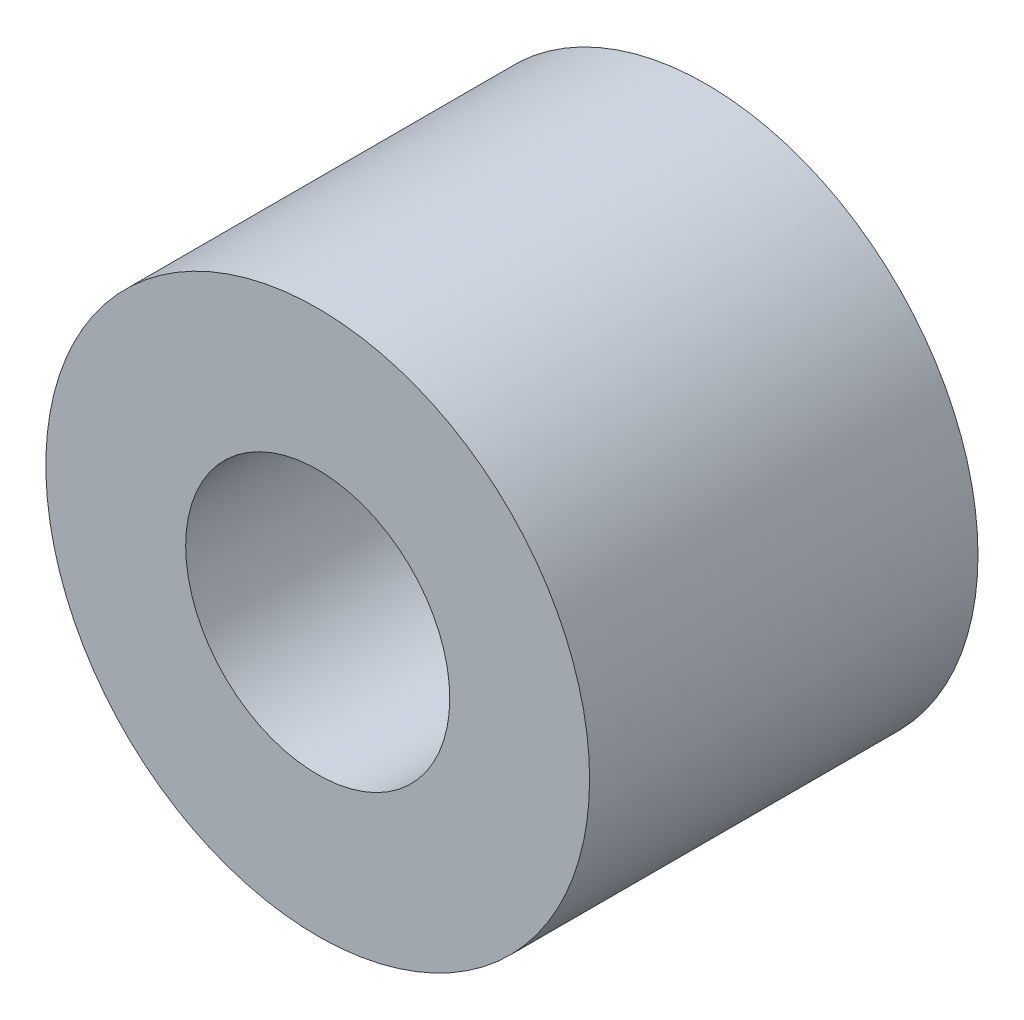
ISO-10303-21;
HEADER;
FILE_DESCRIPTION(('STEP AP214'),'2;1');
FILE_NAME('part.step','',(''),(''),'','','');
FILE_SCHEMA(('AUTOMOTIVE_DESIGN { 1 0 10303 214 1 1 1 1 }'));
ENDSEC;
DATA;
#1=APPLICATION_CONTEXT('core data for automotive mechanical design processes');
#2=APPLICATION_PROTOCOL_DEFINITION('international standard','automotive_design',2000,#1);
#3=PRODUCT_CONTEXT('',#1,'mechanical');
#4=PRODUCT('Part','Part','',(#3));
#5=PRODUCT_RELATED_PRODUCT_CATEGORY('part','',(#4));
#6=PRODUCT_DEFINITION_FORMATION('','',#4);
#7=PRODUCT_DEFINITION_CONTEXT('part definition',#1,'design');
#8=PRODUCT_DEFINITION('design','',#6,#7);
#9=PRODUCT_DEFINITION_SHAPE('','',#8);
#10=(LENGTH_UNIT() NAMED_UNIT(*) SI_UNIT(.MILLI.,.METRE.));
#11=(NAMED_UNIT(*) PLANE_ANGLE_UNIT() SI_UNIT($,.RADIAN.));
#12=(NAMED_UNIT(*) SI_UNIT($,.STERADIAN.) SOLID_ANGLE_UNIT());
#13=UNCERTAINTY_MEASURE_WITH_UNIT(LENGTH_MEASURE(1.E-05),#10,'distance_accuracy_value','');
#14=(GEOMETRIC_REPRESENTATION_CONTEXT(3) GLOBAL_UNCERTAINTY_ASSIGNED_CONTEXT((#13)) GLOBAL_UNIT_ASSIGNED_CONTEXT((#10,
#11,#12)) REPRESENTATION_CONTEXT('',''));
#15=CARTESIAN_POINT('',(0.,0.,0.));
#16=DIRECTION('',(0.,0.,1.));
#17=DIRECTION('',(1.,0.,0.));
#18=AXIS2_PLACEMENT_3D('',#15,#16,#17);
#19=CARTESIAN_POINT('',(21.,-33.5,181.4));
#20=DIRECTION('',(0.,0.,1.));
#21=DIRECTION('',(1.,0.,0.));
#22=AXIS2_PLACEMENT_3D('',#19,#20,#21);
#23=CYLINDRICAL_SURFACE('',#22,1.7);
#24=DIRECTION('',(0.,0.,1.));
#25=VECTOR('',#24,1.);
#26=CARTESIAN_POINT('',(22.7,-33.5,181.4));
#27=LINE('',#26,#25);
#28=CARTESIAN_POINT('',(22.7,-33.5,181.5));
#29=VERTEX_POINT('',#28);
#30=CARTESIAN_POINT('',(22.7,-33.5,186.5));
#31=VERTEX_POINT('',#30);
#32=EDGE_CURVE('E9',#29,#31,#27,.T.);
#33=ORIENTED_EDGE('',*,*,#32,.F.);
#34=CARTESIAN_POINT('',(21.,-33.5,181.5));
#35=DIRECTION('',(0.,0.,1.));
#36=DIRECTION('',(1.,0.,0.));
#37=AXIS2_PLACEMENT_3D('',#34,#35,#36);
#38=CIRCLE('',#37,1.7);
#39=EDGE_CURVE('E23',#29,#29,#38,.T.);
#40=ORIENTED_EDGE('',*,*,#39,.F.);
#41=ORIENTED_EDGE('',*,*,#32,.T.);
#42=CARTESIAN_POINT('',(21.,-33.5,186.5));
#43=DIRECTION('',(0.,0.,1.));
#44=DIRECTION('',(1.,0.,0.));
#45=AXIS2_PLACEMENT_3D('',#42,#43,#44);
#46=CIRCLE('',#45,1.7);
#47=EDGE_CURVE('E54',#31,#31,#46,.T.);
#48=ORIENTED_EDGE('',*,*,#47,.T.);
#49=EDGE_LOOP('',(#33,#40,#41,#48));
#50=FACE_BOUND('',#49,.T.);
#51=ADVANCED_FACE('F14',(#50),#23,.F.);
#52=CARTESIAN_POINT('',(21.,-33.5,181.5));
#53=DIRECTION('',(0.,0.,1.));
#54=DIRECTION('',(1.,0.,0.));
#55=AXIS2_PLACEMENT_3D('',#52,#53,#54);
#56=PLANE('',#55);
#57=ORIENTED_EDGE('',*,*,#39,.T.);
#58=EDGE_LOOP('',(#57));
#59=FACE_BOUND('',#58,.T.);
#60=CARTESIAN_POINT('',(21.,-33.5,181.5));
#61=DIRECTION('',(0.,0.,1.));
#62=DIRECTION('',(1.,0.,0.));
#63=AXIS2_PLACEMENT_3D('',#60,#61,#62);
#64=CIRCLE('',#63,3.5);
#65=CARTESIAN_POINT('',(24.5,-33.5,181.5));
#66=VERTEX_POINT('',#65);
#67=EDGE_CURVE('E50',#66,#66,#64,.T.);
#68=ORIENTED_EDGE('',*,*,#67,.F.);
#69=EDGE_LOOP('',(#68));
#70=FACE_BOUND('',#69,.T.);
#71=ADVANCED_FACE('F66',(#59,#70),#56,.F.);
#72=CARTESIAN_POINT('',(21.,-33.5,186.5));
#73=DIRECTION('',(0.,0.,1.));
#74=DIRECTION('',(1.,0.,0.));
#75=AXIS2_PLACEMENT_3D('',#72,#73,#74);
#76=PLANE('',#75);
#77=ORIENTED_EDGE('',*,*,#47,.F.);
#78=EDGE_LOOP('',(#77));
#79=FACE_BOUND('',#78,.T.);
#80=CARTESIAN_POINT('',(21.,-33.5,186.5));
#81=DIRECTION('',(0.,0.,1.));
#82=DIRECTION('',(1.,0.,0.));
#83=AXIS2_PLACEMENT_3D('',#80,#81,#82);
#84=CIRCLE('',#83,3.5);
#85=CARTESIAN_POINT('',(24.5,-33.5,186.5));
#86=VERTEX_POINT('',#85);
#87=EDGE_CURVE('E60',#86,#86,#84,.T.);
#88=ORIENTED_EDGE('',*,*,#87,.T.);
#89=EDGE_LOOP('',(#88));
#90=FACE_BOUND('',#89,.T.);
#91=ADVANCED_FACE('F69',(#79,#90),#76,.T.);
#92=CARTESIAN_POINT('',(21.,-33.5,181.5));
#93=DIRECTION('',(0.,0.,1.));
#94=DIRECTION('',(1.,0.,0.));
#95=AXIS2_PLACEMENT_3D('',#92,#93,#94);
#96=CYLINDRICAL_SURFACE('',#95,3.5);
#97=ORIENTED_EDGE('',*,*,#87,.F.);
#98=DIRECTION('',(0.,0.,1.));
#99=VECTOR('',#98,1.);
#100=CARTESIAN_POINT('',(24.5,-33.5,181.5));
#101=LINE('',#100,#99);
#102=EDGE_CURVE('E45',#66,#86,#101,.T.);
#103=ORIENTED_EDGE('',*,*,#102,.F.);
#104=ORIENTED_EDGE('',*,*,#67,.T.);
#105=ORIENTED_EDGE('',*,*,#102,.T.);
#106=EDGE_LOOP('',(#97,#103,#104,#105));
#107=FACE_BOUND('',#106,.T.);
#108=ADVANCED_FACE('F51',(#107),#96,.T.);
#109=CLOSED_SHELL('',(#51,#71,#91,#108));
#110=MANIFOLD_SOLID_BREP('B1',#109);
#111=ADVANCED_BREP_SHAPE_REPRESENTATION('',(#18,#110),#14);
#112=SHAPE_DEFINITION_REPRESENTATION(#9,#111);
ENDSEC;
END-ISO-10303-21;
